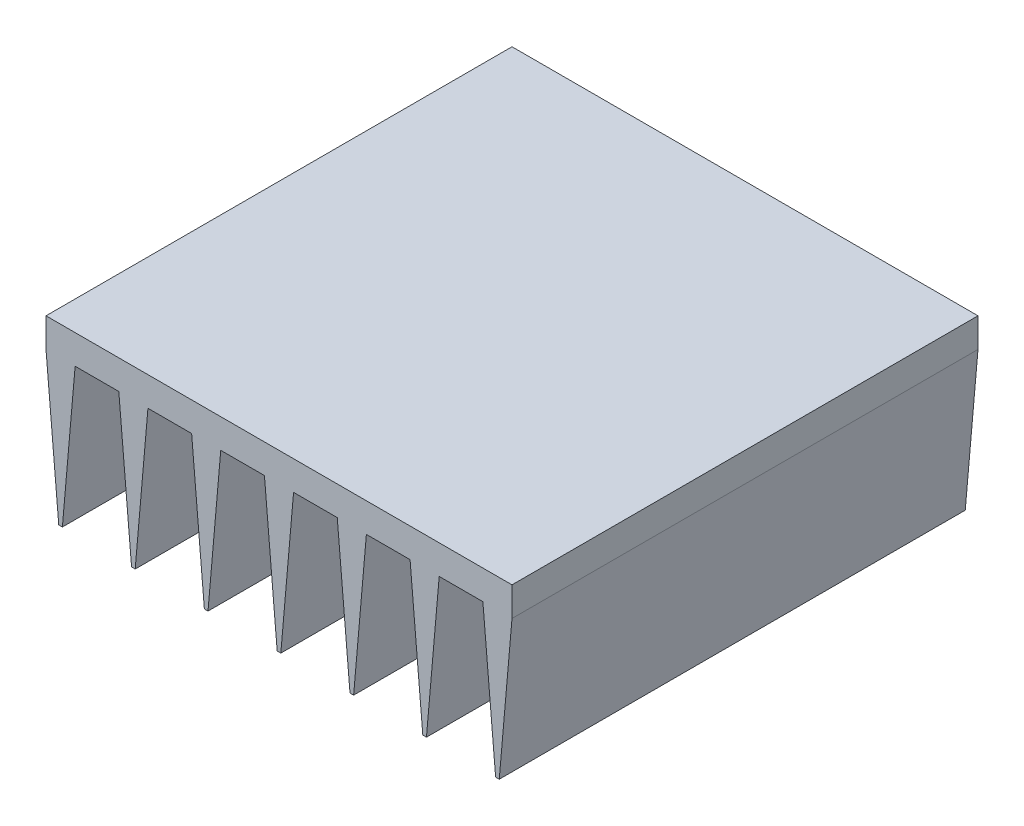
ISO-10303-21;
HEADER;
FILE_DESCRIPTION(('STEP AP214'),'2;1');
FILE_NAME('part.step','',(''),(''),'','','');
FILE_SCHEMA(('AUTOMOTIVE_DESIGN { 1 0 10303 214 1 1 1 1 }'));
ENDSEC;
DATA;
#1=APPLICATION_CONTEXT('core data for automotive mechanical design processes');
#2=APPLICATION_PROTOCOL_DEFINITION('international standard','automotive_design',2000,#1);
#3=PRODUCT_CONTEXT('',#1,'mechanical');
#4=PRODUCT('Part','Part','',(#3));
#5=PRODUCT_RELATED_PRODUCT_CATEGORY('part','',(#4));
#6=PRODUCT_DEFINITION_FORMATION('','',#4);
#7=PRODUCT_DEFINITION_CONTEXT('part definition',#1,'design');
#8=PRODUCT_DEFINITION('design','',#6,#7);
#9=PRODUCT_DEFINITION_SHAPE('','',#8);
#10=(LENGTH_UNIT() NAMED_UNIT(*) SI_UNIT(.MILLI.,.METRE.));
#11=(NAMED_UNIT(*) PLANE_ANGLE_UNIT() SI_UNIT($,.RADIAN.));
#12=(NAMED_UNIT(*) SI_UNIT($,.STERADIAN.) SOLID_ANGLE_UNIT());
#13=UNCERTAINTY_MEASURE_WITH_UNIT(LENGTH_MEASURE(1.E-05),#10,'distance_accuracy_value','');
#14=(GEOMETRIC_REPRESENTATION_CONTEXT(3) GLOBAL_UNCERTAINTY_ASSIGNED_CONTEXT((#13)) GLOBAL_UNIT_ASSIGNED_CONTEXT((#10,
#11,#12)) REPRESENTATION_CONTEXT('',''));
#15=CARTESIAN_POINT('',(0.,0.,0.));
#16=DIRECTION('',(0.,0.,1.));
#17=DIRECTION('',(1.,0.,0.));
#18=AXIS2_PLACEMENT_3D('',#15,#16,#17);
#19=CARTESIAN_POINT('',(0.,-3.175,0.));
#20=DIRECTION('',(0.,1.,0.));
#21=DIRECTION('',(0.,0.,1.));
#22=AXIS2_PLACEMENT_3D('',#19,#20,#21);
#23=PLANE('',#22);
#24=DIRECTION('',(-1.,0.,0.));
#25=VECTOR('',#24,1.);
#26=CARTESIAN_POINT('',(-25.4,-3.175,-25.4));
#27=LINE('',#26,#25);
#28=CARTESIAN_POINT('',(22.225,-3.175,-25.4));
#29=VERTEX_POINT('',#28);
#30=CARTESIAN_POINT('',(17.4625,-3.175,-25.4));
#31=VERTEX_POINT('',#30);
#32=EDGE_CURVE('E265',#29,#31,#27,.T.);
#33=ORIENTED_EDGE('',*,*,#32,.F.);
#34=DIRECTION('',(0.,0.,1.));
#35=VECTOR('',#34,1.);
#36=CARTESIAN_POINT('',(22.225,-3.175,-25.4));
#37=LINE('',#36,#35);
#38=CARTESIAN_POINT('',(22.225,-3.175,25.4));
#39=VERTEX_POINT('',#38);
#40=EDGE_CURVE('E247',#29,#39,#37,.T.);
#41=ORIENTED_EDGE('',*,*,#40,.T.);
#42=DIRECTION('',(1.,0.,0.));
#43=VECTOR('',#42,1.);
#44=CARTESIAN_POINT('',(-25.4,-3.175,25.4));
#45=LINE('',#44,#43);
#46=CARTESIAN_POINT('',(17.4625,-3.175,25.4));
#47=VERTEX_POINT('',#46);
#48=EDGE_CURVE('E304',#47,#39,#45,.T.);
#49=ORIENTED_EDGE('',*,*,#48,.F.);
#50=DIRECTION('',(0.,0.,1.));
#51=VECTOR('',#50,1.);
#52=CARTESIAN_POINT('',(17.4625,-3.175,-25.4));
#53=LINE('',#52,#51);
#54=EDGE_CURVE('E274',#31,#47,#53,.T.);
#55=ORIENTED_EDGE('',*,*,#54,.F.);
#56=EDGE_LOOP('',(#33,#41,#49,#55));
#57=FACE_BOUND('',#56,.T.);
#58=ADVANCED_FACE('F45',(#57),#23,.F.);
#59=CARTESIAN_POINT('',(14.2875,-3.175,-25.4));
#60=VERTEX_POINT('',#59);
#61=CARTESIAN_POINT('',(9.52500000000001,-3.175,-25.4));
#62=VERTEX_POINT('',#61);
#63=EDGE_CURVE('E276',#60,#62,#27,.T.);
#64=ORIENTED_EDGE('',*,*,#63,.F.);
#65=DIRECTION('',(0.,0.,1.));
#66=VECTOR('',#65,1.);
#67=CARTESIAN_POINT('',(14.2875,-3.175,-25.4));
#68=LINE('',#67,#66);
#69=CARTESIAN_POINT('',(14.2875,-3.175,25.4));
#70=VERTEX_POINT('',#69);
#71=EDGE_CURVE('E491',#60,#70,#68,.T.);
#72=ORIENTED_EDGE('',*,*,#71,.T.);
#73=CARTESIAN_POINT('',(9.525,-3.175,25.4));
#74=VERTEX_POINT('',#73);
#75=EDGE_CURVE('E550',#74,#70,#45,.T.);
#76=ORIENTED_EDGE('',*,*,#75,.F.);
#77=DIRECTION('',(0.,0.,1.));
#78=VECTOR('',#77,1.);
#79=CARTESIAN_POINT('',(9.52500000000001,-3.175,-25.4));
#80=LINE('',#79,#78);
#81=EDGE_CURVE('E447',#62,#74,#80,.T.);
#82=ORIENTED_EDGE('',*,*,#81,.F.);
#83=EDGE_LOOP('',(#64,#72,#76,#82));
#84=FACE_BOUND('',#83,.T.);
#85=ADVANCED_FACE('F613',(#84),#23,.F.);
#86=CARTESIAN_POINT('',(6.35,-3.175,-25.4));
#87=VERTEX_POINT('',#86);
#88=CARTESIAN_POINT('',(1.58750000000001,-3.175,-25.4));
#89=VERTEX_POINT('',#88);
#90=EDGE_CURVE('E282',#87,#89,#27,.T.);
#91=ORIENTED_EDGE('',*,*,#90,.F.);
#92=DIRECTION('',(0.,0.,1.));
#93=VECTOR('',#92,1.);
#94=CARTESIAN_POINT('',(6.35,-3.175,-25.4));
#95=LINE('',#94,#93);
#96=CARTESIAN_POINT('',(6.35,-3.175,25.4));
#97=VERTEX_POINT('',#96);
#98=EDGE_CURVE('E458',#87,#97,#95,.T.);
#99=ORIENTED_EDGE('',*,*,#98,.T.);
#100=CARTESIAN_POINT('',(1.5875,-3.175,25.4));
#101=VERTEX_POINT('',#100);
#102=EDGE_CURVE('E552',#101,#97,#45,.T.);
#103=ORIENTED_EDGE('',*,*,#102,.F.);
#104=DIRECTION('',(0.,0.,1.));
#105=VECTOR('',#104,1.);
#106=CARTESIAN_POINT('',(1.58750000000001,-3.175,-25.4));
#107=LINE('',#106,#105);
#108=EDGE_CURVE('E410',#89,#101,#107,.T.);
#109=ORIENTED_EDGE('',*,*,#108,.F.);
#110=EDGE_LOOP('',(#91,#99,#103,#109));
#111=FACE_BOUND('',#110,.T.);
#112=ADVANCED_FACE('F599',(#111),#23,.F.);
#113=CARTESIAN_POINT('',(-1.5875,-3.175,-25.4));
#114=VERTEX_POINT('',#113);
#115=CARTESIAN_POINT('',(-6.34999999999999,-3.175,-25.4));
#116=VERTEX_POINT('',#115);
#117=EDGE_CURVE('E294',#114,#116,#27,.T.);
#118=ORIENTED_EDGE('',*,*,#117,.F.);
#119=DIRECTION('',(0.,0.,1.));
#120=VECTOR('',#119,1.);
#121=CARTESIAN_POINT('',(-1.5875,-3.175,-25.4));
#122=LINE('',#121,#120);
#123=CARTESIAN_POINT('',(-1.5875,-3.175,25.4));
#124=VERTEX_POINT('',#123);
#125=EDGE_CURVE('E421',#114,#124,#122,.T.);
#126=ORIENTED_EDGE('',*,*,#125,.T.);
#127=CARTESIAN_POINT('',(-6.35,-3.175,25.4));
#128=VERTEX_POINT('',#127);
#129=EDGE_CURVE('E556',#128,#124,#45,.T.);
#130=ORIENTED_EDGE('',*,*,#129,.F.);
#131=DIRECTION('',(0.,0.,1.));
#132=VECTOR('',#131,1.);
#133=CARTESIAN_POINT('',(-6.34999999999999,-3.175,-25.4));
#134=LINE('',#133,#132);
#135=EDGE_CURVE('E373',#116,#128,#134,.T.);
#136=ORIENTED_EDGE('',*,*,#135,.F.);
#137=EDGE_LOOP('',(#118,#126,#130,#136));
#138=FACE_BOUND('',#137,.T.);
#139=ADVANCED_FACE('F584',(#138),#23,.F.);
#140=CARTESIAN_POINT('',(-9.525,-3.175,-25.4));
#141=VERTEX_POINT('',#140);
#142=CARTESIAN_POINT('',(-14.2875,-3.175,-25.4));
#143=VERTEX_POINT('',#142);
#144=EDGE_CURVE('E286',#141,#143,#27,.T.);
#145=ORIENTED_EDGE('',*,*,#144,.F.);
#146=DIRECTION('',(0.,0.,1.));
#147=VECTOR('',#146,1.);
#148=CARTESIAN_POINT('',(-9.525,-3.175,-25.4));
#149=LINE('',#148,#147);
#150=CARTESIAN_POINT('',(-9.525,-3.175,25.4));
#151=VERTEX_POINT('',#150);
#152=EDGE_CURVE('E384',#141,#151,#149,.T.);
#153=ORIENTED_EDGE('',*,*,#152,.T.);
#154=CARTESIAN_POINT('',(-14.2875,-3.175,25.4));
#155=VERTEX_POINT('',#154);
#156=EDGE_CURVE('E302',#155,#151,#45,.T.);
#157=ORIENTED_EDGE('',*,*,#156,.F.);
#158=DIRECTION('',(0.,0.,1.));
#159=VECTOR('',#158,1.);
#160=CARTESIAN_POINT('',(-14.2875,-3.175,-25.4));
#161=LINE('',#160,#159);
#162=EDGE_CURVE('E336',#143,#155,#161,.T.);
#163=ORIENTED_EDGE('',*,*,#162,.F.);
#164=EDGE_LOOP('',(#145,#153,#157,#163));
#165=FACE_BOUND('',#164,.T.);
#166=ADVANCED_FACE('F568',(#165),#23,.F.);
#167=CARTESIAN_POINT('',(-17.4625,-3.175,-25.4));
#168=VERTEX_POINT('',#167);
#169=CARTESIAN_POINT('',(-22.225,-3.175,-25.4));
#170=VERTEX_POINT('',#169);
#171=EDGE_CURVE('E278',#168,#170,#27,.T.);
#172=ORIENTED_EDGE('',*,*,#171,.F.);
#173=DIRECTION('',(0.,0.,1.));
#174=VECTOR('',#173,1.);
#175=CARTESIAN_POINT('',(-17.4625,-3.175,-25.4));
#176=LINE('',#175,#174);
#177=CARTESIAN_POINT('',(-17.4625,-3.175,25.4));
#178=VERTEX_POINT('',#177);
#179=EDGE_CURVE('E347',#168,#178,#176,.T.);
#180=ORIENTED_EDGE('',*,*,#179,.T.);
#181=CARTESIAN_POINT('',(-22.225,-3.175,25.4));
#182=VERTEX_POINT('',#181);
#183=EDGE_CURVE('E296',#182,#178,#45,.T.);
#184=ORIENTED_EDGE('',*,*,#183,.F.);
#185=DIRECTION('',(0.,0.,1.));
#186=VECTOR('',#185,1.);
#187=CARTESIAN_POINT('',(-22.225,-3.175,-25.4));
#188=LINE('',#187,#186);
#189=EDGE_CURVE('E318',#170,#182,#188,.T.);
#190=ORIENTED_EDGE('',*,*,#189,.F.);
#191=EDGE_LOOP('',(#172,#180,#184,#190));
#192=FACE_BOUND('',#191,.T.);
#193=ADVANCED_FACE('F634',(#192),#23,.F.);
#194=CARTESIAN_POINT('',(-25.4,-3.175,-25.4));
#195=DIRECTION('',(-1.,0.,0.));
#196=DIRECTION('',(0.,0.,1.));
#197=AXIS2_PLACEMENT_3D('',#194,#195,#196);
#198=PLANE('',#197);
#199=DIRECTION('',(0.,0.,1.));
#200=VECTOR('',#199,1.);
#201=CARTESIAN_POINT('',(-25.4,0.,-25.4));
#202=LINE('',#201,#200);
#203=CARTESIAN_POINT('',(-25.4,0.,-25.4));
#204=VERTEX_POINT('',#203);
#205=CARTESIAN_POINT('',(-25.4,0.,25.4));
#206=VERTEX_POINT('',#205);
#207=EDGE_CURVE('E322',#204,#206,#202,.T.);
#208=ORIENTED_EDGE('',*,*,#207,.F.);
#209=DIRECTION('',(0.,1.,0.));
#210=VECTOR('',#209,1.);
#211=CARTESIAN_POINT('',(-25.4,-3.175,-25.4));
#212=LINE('',#211,#210);
#213=CARTESIAN_POINT('',(-25.4,-3.175,-25.4));
#214=VERTEX_POINT('',#213);
#215=EDGE_CURVE('E11',#214,#204,#212,.T.);
#216=ORIENTED_EDGE('',*,*,#215,.F.);
#217=DIRECTION('',(0.,0.,1.));
#218=VECTOR('',#217,1.);
#219=CARTESIAN_POINT('',(-25.4,-3.175,-25.4));
#220=LINE('',#219,#218);
#221=CARTESIAN_POINT('',(-25.4,-3.175,25.4));
#222=VERTEX_POINT('',#221);
#223=EDGE_CURVE('E306',#214,#222,#220,.T.);
#224=ORIENTED_EDGE('',*,*,#223,.T.);
#225=DIRECTION('',(0.,1.,0.));
#226=VECTOR('',#225,1.);
#227=CARTESIAN_POINT('',(-25.4,-3.175,25.4));
#228=LINE('',#227,#226);
#229=EDGE_CURVE('E49',#222,#206,#228,.T.);
#230=ORIENTED_EDGE('',*,*,#229,.T.);
#231=EDGE_LOOP('',(#208,#216,#224,#230));
#232=FACE_BOUND('',#231,.T.);
#233=ADVANCED_FACE('F47',(#232),#198,.T.);
#234=CARTESIAN_POINT('',(-25.4,-3.175,-25.4));
#235=DIRECTION('',(0.,0.,-1.));
#236=DIRECTION('',(-1.,0.,0.));
#237=AXIS2_PLACEMENT_3D('',#234,#235,#236);
#238=PLANE('',#237);
#239=DIRECTION('',(-1.,0.,0.));
#240=VECTOR('',#239,1.);
#241=CARTESIAN_POINT('',(-25.4,0.,-25.4));
#242=LINE('',#241,#240);
#243=CARTESIAN_POINT('',(25.4,0.,-25.4));
#244=VERTEX_POINT('',#243);
#245=EDGE_CURVE('E310',#244,#204,#242,.T.);
#246=ORIENTED_EDGE('',*,*,#245,.F.);
#247=DIRECTION('',(0.,1.,0.));
#248=VECTOR('',#247,1.);
#249=CARTESIAN_POINT('',(25.4,-3.175,-25.4));
#250=LINE('',#249,#248);
#251=CARTESIAN_POINT('',(25.4,-3.175,-25.4));
#252=VERTEX_POINT('',#251);
#253=EDGE_CURVE('E55',#252,#244,#250,.T.);
#254=ORIENTED_EDGE('',*,*,#253,.F.);
#255=DIRECTION('',(0.0871867227206115,0.996191987209915,0.));
#256=VECTOR('',#255,1.);
#257=CARTESIAN_POINT('',(24.01062,-19.05,-25.4));
#258=LINE('',#257,#256);
#259=CARTESIAN_POINT('',(24.01062,-19.05,-25.4));
#260=VERTEX_POINT('',#259);
#261=EDGE_CURVE('E258',#260,#252,#258,.T.);
#262=ORIENTED_EDGE('',*,*,#261,.F.);
#263=DIRECTION('',(1.,0.,0.));
#264=VECTOR('',#263,1.);
#265=CARTESIAN_POINT('',(23.61438,-19.05,-25.4));
#266=LINE('',#265,#264);
#267=CARTESIAN_POINT('',(23.61438,-19.05,-25.4));
#268=VERTEX_POINT('',#267);
#269=EDGE_CURVE('E269',#268,#260,#266,.T.);
#270=ORIENTED_EDGE('',*,*,#269,.F.);
#271=DIRECTION('',(0.0871867227206121,-0.996191987209915,0.));
#272=VECTOR('',#271,1.);
#273=CARTESIAN_POINT('',(22.225,-3.175,-25.4));
#274=LINE('',#273,#272);
#275=EDGE_CURVE('E250',#29,#268,#274,.T.);
#276=ORIENTED_EDGE('',*,*,#275,.F.);
#277=ORIENTED_EDGE('',*,*,#32,.T.);
#278=DIRECTION('',(0.0871867227206115,0.996191987209915,0.));
#279=VECTOR('',#278,1.);
#280=CARTESIAN_POINT('',(16.07312,-19.05,-25.4));
#281=LINE('',#280,#279);
#282=CARTESIAN_POINT('',(16.07312,-19.05,-25.4));
#283=VERTEX_POINT('',#282);
#284=EDGE_CURVE('E496',#283,#31,#281,.T.);
#285=ORIENTED_EDGE('',*,*,#284,.F.);
#286=DIRECTION('',(1.,0.,0.));
#287=VECTOR('',#286,1.);
#288=CARTESIAN_POINT('',(15.67688,-19.05,-25.4));
#289=LINE('',#288,#287);
#290=CARTESIAN_POINT('',(15.67688,-19.05,-25.4));
#291=VERTEX_POINT('',#290);
#292=EDGE_CURVE('E517',#291,#283,#289,.T.);
#293=ORIENTED_EDGE('',*,*,#292,.F.);
#294=DIRECTION('',(0.0871867227206121,-0.996191987209915,0.));
#295=VECTOR('',#294,1.);
#296=CARTESIAN_POINT('',(14.2875,-3.175,-25.4));
#297=LINE('',#296,#295);
#298=EDGE_CURVE('E506',#60,#291,#297,.T.);
#299=ORIENTED_EDGE('',*,*,#298,.F.);
#300=ORIENTED_EDGE('',*,*,#63,.T.);
#301=DIRECTION('',(0.0871867227206115,0.996191987209915,0.));
#302=VECTOR('',#301,1.);
#303=CARTESIAN_POINT('',(8.13562000000001,-19.05,-25.4));
#304=LINE('',#303,#302);
#305=CARTESIAN_POINT('',(8.13562000000001,-19.05,-25.4));
#306=VERTEX_POINT('',#305);
#307=EDGE_CURVE('E463',#306,#62,#304,.T.);
#308=ORIENTED_EDGE('',*,*,#307,.F.);
#309=DIRECTION('',(1.,0.,0.));
#310=VECTOR('',#309,1.);
#311=CARTESIAN_POINT('',(7.73938000000001,-19.05,-25.4));
#312=LINE('',#311,#310);
#313=CARTESIAN_POINT('',(7.73938000000001,-19.05,-25.4));
#314=VERTEX_POINT('',#313);
#315=EDGE_CURVE('E484',#314,#306,#312,.T.);
#316=ORIENTED_EDGE('',*,*,#315,.F.);
#317=DIRECTION('',(0.0871867227206121,-0.996191987209915,0.));
#318=VECTOR('',#317,1.);
#319=CARTESIAN_POINT('',(6.35,-3.175,-25.4));
#320=LINE('',#319,#318);
#321=EDGE_CURVE('E473',#87,#314,#320,.T.);
#322=ORIENTED_EDGE('',*,*,#321,.F.);
#323=ORIENTED_EDGE('',*,*,#90,.T.);
#324=DIRECTION('',(0.0871867227206115,0.996191987209915,0.));
#325=VECTOR('',#324,1.);
#326=CARTESIAN_POINT('',(0.19812000000001,-19.05,-25.4));
#327=LINE('',#326,#325);
#328=CARTESIAN_POINT('',(0.19812000000001,-19.05,-25.4));
#329=VERTEX_POINT('',#328);
#330=EDGE_CURVE('E426',#329,#89,#327,.T.);
#331=ORIENTED_EDGE('',*,*,#330,.F.);
#332=DIRECTION('',(1.,0.,0.));
#333=VECTOR('',#332,1.);
#334=CARTESIAN_POINT('',(-0.198119999999989,-19.05,-25.4));
#335=LINE('',#334,#333);
#336=CARTESIAN_POINT('',(-0.198119999999989,-19.05,-25.4));
#337=VERTEX_POINT('',#336);
#338=EDGE_CURVE('E451',#337,#329,#335,.T.);
#339=ORIENTED_EDGE('',*,*,#338,.F.);
#340=DIRECTION('',(0.0871867227206121,-0.996191987209915,0.));
#341=VECTOR('',#340,1.);
#342=CARTESIAN_POINT('',(-1.5875,-3.175,-25.4));
#343=LINE('',#342,#341);
#344=EDGE_CURVE('E438',#114,#337,#343,.T.);
#345=ORIENTED_EDGE('',*,*,#344,.F.);
#346=ORIENTED_EDGE('',*,*,#117,.T.);
#347=DIRECTION('',(0.0871867227206115,0.996191987209915,0.));
#348=VECTOR('',#347,1.);
#349=CARTESIAN_POINT('',(-7.73937999999999,-19.05,-25.4));
#350=LINE('',#349,#348);
#351=CARTESIAN_POINT('',(-7.73937999999999,-19.05,-25.4));
#352=VERTEX_POINT('',#351);
#353=EDGE_CURVE('E389',#352,#116,#350,.T.);
#354=ORIENTED_EDGE('',*,*,#353,.F.);
#355=DIRECTION('',(1.,0.,0.));
#356=VECTOR('',#355,1.);
#357=CARTESIAN_POINT('',(-8.13561999999999,-19.05,-25.4));
#358=LINE('',#357,#356);
#359=CARTESIAN_POINT('',(-8.13561999999999,-19.05,-25.4));
#360=VERTEX_POINT('',#359);
#361=EDGE_CURVE('E414',#360,#352,#358,.T.);
#362=ORIENTED_EDGE('',*,*,#361,.F.);
#363=DIRECTION('',(0.0871867227206121,-0.996191987209915,0.));
#364=VECTOR('',#363,1.);
#365=CARTESIAN_POINT('',(-9.525,-3.175,-25.4));
#366=LINE('',#365,#364);
#367=EDGE_CURVE('E401',#141,#360,#366,.T.);
#368=ORIENTED_EDGE('',*,*,#367,.F.);
#369=ORIENTED_EDGE('',*,*,#144,.T.);
#370=DIRECTION('',(0.0871867227206115,0.996191987209915,0.));
#371=VECTOR('',#370,1.);
#372=CARTESIAN_POINT('',(-15.67688,-19.05,-25.4));
#373=LINE('',#372,#371);
#374=CARTESIAN_POINT('',(-15.67688,-19.05,-25.4));
#375=VERTEX_POINT('',#374);
#376=EDGE_CURVE('E352',#375,#143,#373,.T.);
#377=ORIENTED_EDGE('',*,*,#376,.F.);
#378=DIRECTION('',(1.,0.,0.));
#379=VECTOR('',#378,1.);
#380=CARTESIAN_POINT('',(-16.07312,-19.05,-25.4));
#381=LINE('',#380,#379);
#382=CARTESIAN_POINT('',(-16.07312,-19.05,-25.4));
#383=VERTEX_POINT('',#382);
#384=EDGE_CURVE('E377',#383,#375,#381,.T.);
#385=ORIENTED_EDGE('',*,*,#384,.F.);
#386=DIRECTION('',(0.0871867227206121,-0.996191987209915,0.));
#387=VECTOR('',#386,1.);
#388=CARTESIAN_POINT('',(-17.4625,-3.175,-25.4));
#389=LINE('',#388,#387);
#390=EDGE_CURVE('E364',#168,#383,#389,.T.);
#391=ORIENTED_EDGE('',*,*,#390,.F.);
#392=ORIENTED_EDGE('',*,*,#171,.T.);
#393=DIRECTION('',(0.0871867227206115,0.996191987209915,0.));
#394=VECTOR('',#393,1.);
#395=CARTESIAN_POINT('',(-23.61438,-19.05,-25.4));
#396=LINE('',#395,#394);
#397=CARTESIAN_POINT('',(-23.61438,-19.05,-25.4));
#398=VERTEX_POINT('',#397);
#399=EDGE_CURVE('E315',#398,#170,#396,.T.);
#400=ORIENTED_EDGE('',*,*,#399,.F.);
#401=DIRECTION('',(1.,0.,0.));
#402=VECTOR('',#401,1.);
#403=CARTESIAN_POINT('',(-24.01062,-19.05,-25.4));
#404=LINE('',#403,#402);
#405=CARTESIAN_POINT('',(-24.01062,-19.05,-25.4));
#406=VERTEX_POINT('',#405);
#407=EDGE_CURVE('E340',#406,#398,#404,.T.);
#408=ORIENTED_EDGE('',*,*,#407,.F.);
#409=DIRECTION('',(0.0871867227206121,-0.996191987209915,0.));
#410=VECTOR('',#409,1.);
#411=CARTESIAN_POINT('',(-25.4,-3.175,-25.4));
#412=LINE('',#411,#410);
#413=EDGE_CURVE('E327',#214,#406,#412,.T.);
#414=ORIENTED_EDGE('',*,*,#413,.F.);
#415=ORIENTED_EDGE('',*,*,#215,.T.);
#416=EDGE_LOOP('',(#246,#254,#262,#270,#276,#277,#285,#293,#299,#300,#308,#316,#322,#323,#331,
#339,#345,#346,#354,#362,#368,#369,#377,#385,#391,#392,#400,#408,#414,#415));
#417=FACE_BOUND('',#416,.T.);
#418=ADVANCED_FACE('F263',(#417),#238,.T.);
#419=CARTESIAN_POINT('',(25.4,-3.175,-25.4));
#420=DIRECTION('',(1.,0.,0.));
#421=DIRECTION('',(0.,0.,-1.));
#422=AXIS2_PLACEMENT_3D('',#419,#420,#421);
#423=PLANE('',#422);
#424=DIRECTION('',(0.,0.,-1.));
#425=VECTOR('',#424,1.);
#426=CARTESIAN_POINT('',(25.4,0.,-25.4));
#427=LINE('',#426,#425);
#428=CARTESIAN_POINT('',(25.4,0.,25.4));
#429=VERTEX_POINT('',#428);
#430=EDGE_CURVE('E664',#429,#244,#427,.T.);
#431=ORIENTED_EDGE('',*,*,#430,.F.);
#432=DIRECTION('',(0.,1.,0.));
#433=VECTOR('',#432,1.);
#434=CARTESIAN_POINT('',(25.4,-3.175,25.4));
#435=LINE('',#434,#433);
#436=CARTESIAN_POINT('',(25.4,-3.175,25.4));
#437=VERTEX_POINT('',#436);
#438=EDGE_CURVE('E281',#437,#429,#435,.T.);
#439=ORIENTED_EDGE('',*,*,#438,.F.);
#440=DIRECTION('',(0.,0.,-1.));
#441=VECTOR('',#440,1.);
#442=CARTESIAN_POINT('',(25.4,-3.175,-25.4));
#443=LINE('',#442,#441);
#444=EDGE_CURVE('E287',#437,#252,#443,.T.);
#445=ORIENTED_EDGE('',*,*,#444,.T.);
#446=ORIENTED_EDGE('',*,*,#253,.T.);
#447=EDGE_LOOP('',(#431,#439,#445,#446));
#448=FACE_BOUND('',#447,.T.);
#449=ADVANCED_FACE('F673',(#448),#423,.T.);
#450=CARTESIAN_POINT('',(-25.4,-3.175,25.4));
#451=DIRECTION('',(0.,0.,1.));
#452=DIRECTION('',(1.,0.,0.));
#453=AXIS2_PLACEMENT_3D('',#450,#451,#452);
#454=PLANE('',#453);
#455=DIRECTION('',(1.,0.,0.));
#456=VECTOR('',#455,1.);
#457=CARTESIAN_POINT('',(-25.4,0.,25.4));
#458=LINE('',#457,#456);
#459=EDGE_CURVE('E667',#206,#429,#458,.T.);
#460=ORIENTED_EDGE('',*,*,#459,.F.);
#461=ORIENTED_EDGE('',*,*,#229,.F.);
#462=DIRECTION('',(0.0871867227206121,-0.996191987209915,0.));
#463=VECTOR('',#462,1.);
#464=CARTESIAN_POINT('',(-25.4,-3.175,25.4));
#465=LINE('',#464,#463);
#466=CARTESIAN_POINT('',(-24.01062,-19.05,25.4));
#467=VERTEX_POINT('',#466);
#468=EDGE_CURVE('E332',#222,#467,#465,.T.);
#469=ORIENTED_EDGE('',*,*,#468,.T.);
#470=DIRECTION('',(1.,0.,0.));
#471=VECTOR('',#470,1.);
#472=CARTESIAN_POINT('',(-24.01062,-19.05,25.4));
#473=LINE('',#472,#471);
#474=CARTESIAN_POINT('',(-23.61438,-19.05,25.4));
#475=VERTEX_POINT('',#474);
#476=EDGE_CURVE('E328',#467,#475,#473,.T.);
#477=ORIENTED_EDGE('',*,*,#476,.T.);
#478=DIRECTION('',(0.0871867227206115,0.996191987209915,0.));
#479=VECTOR('',#478,1.);
#480=CARTESIAN_POINT('',(-23.61438,-19.05,25.4));
#481=LINE('',#480,#479);
#482=EDGE_CURVE('E323',#475,#182,#481,.T.);
#483=ORIENTED_EDGE('',*,*,#482,.T.);
#484=ORIENTED_EDGE('',*,*,#183,.T.);
#485=DIRECTION('',(0.0871867227206121,-0.996191987209915,0.));
#486=VECTOR('',#485,1.);
#487=CARTESIAN_POINT('',(-17.4625,-3.175,25.4));
#488=LINE('',#487,#486);
#489=CARTESIAN_POINT('',(-16.07312,-19.05,25.4));
#490=VERTEX_POINT('',#489);
#491=EDGE_CURVE('E369',#178,#490,#488,.T.);
#492=ORIENTED_EDGE('',*,*,#491,.T.);
#493=DIRECTION('',(1.,0.,0.));
#494=VECTOR('',#493,1.);
#495=CARTESIAN_POINT('',(-16.07312,-19.05,25.4));
#496=LINE('',#495,#494);
#497=CARTESIAN_POINT('',(-15.67688,-19.05,25.4));
#498=VERTEX_POINT('',#497);
#499=EDGE_CURVE('E365',#490,#498,#496,.T.);
#500=ORIENTED_EDGE('',*,*,#499,.T.);
#501=DIRECTION('',(0.0871867227206115,0.996191987209915,0.));
#502=VECTOR('',#501,1.);
#503=CARTESIAN_POINT('',(-15.67688,-19.05,25.4));
#504=LINE('',#503,#502);
#505=EDGE_CURVE('E361',#498,#155,#504,.T.);
#506=ORIENTED_EDGE('',*,*,#505,.T.);
#507=ORIENTED_EDGE('',*,*,#156,.T.);
#508=DIRECTION('',(0.0871867227206121,-0.996191987209915,0.));
#509=VECTOR('',#508,1.);
#510=CARTESIAN_POINT('',(-9.525,-3.175,25.4));
#511=LINE('',#510,#509);
#512=CARTESIAN_POINT('',(-8.13561999999999,-19.05,25.4));
#513=VERTEX_POINT('',#512);
#514=EDGE_CURVE('E406',#151,#513,#511,.T.);
#515=ORIENTED_EDGE('',*,*,#514,.T.);
#516=DIRECTION('',(1.,0.,0.));
#517=VECTOR('',#516,1.);
#518=CARTESIAN_POINT('',(-8.13561999999999,-19.05,25.4));
#519=LINE('',#518,#517);
#520=CARTESIAN_POINT('',(-7.73937999999999,-19.05,25.4));
#521=VERTEX_POINT('',#520);
#522=EDGE_CURVE('E402',#513,#521,#519,.T.);
#523=ORIENTED_EDGE('',*,*,#522,.T.);
#524=DIRECTION('',(0.0871867227206115,0.996191987209915,0.));
#525=VECTOR('',#524,1.);
#526=CARTESIAN_POINT('',(-7.73937999999999,-19.05,25.4));
#527=LINE('',#526,#525);
#528=EDGE_CURVE('E398',#521,#128,#527,.T.);
#529=ORIENTED_EDGE('',*,*,#528,.T.);
#530=ORIENTED_EDGE('',*,*,#129,.T.);
#531=DIRECTION('',(0.0871867227206121,-0.996191987209915,0.));
#532=VECTOR('',#531,1.);
#533=CARTESIAN_POINT('',(-1.5875,-3.175,25.4));
#534=LINE('',#533,#532);
#535=CARTESIAN_POINT('',(-0.198119999999989,-19.05,25.4));
#536=VERTEX_POINT('',#535);
#537=EDGE_CURVE('E443',#124,#536,#534,.T.);
#538=ORIENTED_EDGE('',*,*,#537,.T.);
#539=DIRECTION('',(1.,0.,0.));
#540=VECTOR('',#539,1.);
#541=CARTESIAN_POINT('',(-0.198119999999989,-19.05,25.4));
#542=LINE('',#541,#540);
#543=CARTESIAN_POINT('',(0.19812000000001,-19.05,25.4));
#544=VERTEX_POINT('',#543);
#545=EDGE_CURVE('E439',#536,#544,#542,.T.);
#546=ORIENTED_EDGE('',*,*,#545,.T.);
#547=DIRECTION('',(0.0871867227206115,0.996191987209915,0.));
#548=VECTOR('',#547,1.);
#549=CARTESIAN_POINT('',(0.19812000000001,-19.05,25.4));
#550=LINE('',#549,#548);
#551=EDGE_CURVE('E435',#544,#101,#550,.T.);
#552=ORIENTED_EDGE('',*,*,#551,.T.);
#553=ORIENTED_EDGE('',*,*,#102,.T.);
#554=DIRECTION('',(0.0871867227206121,-0.996191987209915,0.));
#555=VECTOR('',#554,1.);
#556=CARTESIAN_POINT('',(6.35,-3.175,25.4));
#557=LINE('',#556,#555);
#558=CARTESIAN_POINT('',(7.73938000000001,-19.05,25.4));
#559=VERTEX_POINT('',#558);
#560=EDGE_CURVE('E477',#97,#559,#557,.T.);
#561=ORIENTED_EDGE('',*,*,#560,.T.);
#562=DIRECTION('',(1.,0.,0.));
#563=VECTOR('',#562,1.);
#564=CARTESIAN_POINT('',(7.73938000000001,-19.05,25.4));
#565=LINE('',#564,#563);
#566=CARTESIAN_POINT('',(8.13562000000001,-19.05,25.4));
#567=VERTEX_POINT('',#566);
#568=EDGE_CURVE('E474',#559,#567,#565,.T.);
#569=ORIENTED_EDGE('',*,*,#568,.T.);
#570=DIRECTION('',(0.0871867227206115,0.996191987209915,0.));
#571=VECTOR('',#570,1.);
#572=CARTESIAN_POINT('',(8.13562000000001,-19.05,25.4));
#573=LINE('',#572,#571);
#574=EDGE_CURVE('E70',#567,#74,#573,.T.);
#575=ORIENTED_EDGE('',*,*,#574,.T.);
#576=ORIENTED_EDGE('',*,*,#75,.T.);
#577=DIRECTION('',(0.0871867227206121,-0.996191987209915,0.));
#578=VECTOR('',#577,1.);
#579=CARTESIAN_POINT('',(14.2875,-3.175,25.4));
#580=LINE('',#579,#578);
#581=CARTESIAN_POINT('',(15.67688,-19.05,25.4));
#582=VERTEX_POINT('',#581);
#583=EDGE_CURVE('E510',#70,#582,#580,.T.);
#584=ORIENTED_EDGE('',*,*,#583,.T.);
#585=DIRECTION('',(1.,0.,0.));
#586=VECTOR('',#585,1.);
#587=CARTESIAN_POINT('',(15.67688,-19.05,25.4));
#588=LINE('',#587,#586);
#589=CARTESIAN_POINT('',(16.07312,-19.05,25.4));
#590=VERTEX_POINT('',#589);
#591=EDGE_CURVE('E507',#582,#590,#588,.T.);
#592=ORIENTED_EDGE('',*,*,#591,.T.);
#593=DIRECTION('',(0.0871867227206115,0.996191987209915,0.));
#594=VECTOR('',#593,1.);
#595=CARTESIAN_POINT('',(16.07312,-19.05,25.4));
#596=LINE('',#595,#594);
#597=EDGE_CURVE('E63',#590,#47,#596,.T.);
#598=ORIENTED_EDGE('',*,*,#597,.T.);
#599=ORIENTED_EDGE('',*,*,#48,.T.);
#600=DIRECTION('',(0.0871867227206121,-0.996191987209915,0.));
#601=VECTOR('',#600,1.);
#602=CARTESIAN_POINT('',(22.225,-3.175,25.4));
#603=LINE('',#602,#601);
#604=CARTESIAN_POINT('',(23.61438,-19.05,25.4));
#605=VERTEX_POINT('',#604);
#606=EDGE_CURVE('E252',#39,#605,#603,.T.);
#607=ORIENTED_EDGE('',*,*,#606,.T.);
#608=DIRECTION('',(1.,0.,0.));
#609=VECTOR('',#608,1.);
#610=CARTESIAN_POINT('',(23.61438,-19.05,25.4));
#611=LINE('',#610,#609);
#612=CARTESIAN_POINT('',(24.01062,-19.05,25.4));
#613=VERTEX_POINT('',#612);
#614=EDGE_CURVE('E530',#605,#613,#611,.T.);
#615=ORIENTED_EDGE('',*,*,#614,.T.);
#616=DIRECTION('',(0.0871867227206115,0.996191987209915,0.));
#617=VECTOR('',#616,1.);
#618=CARTESIAN_POINT('',(24.01062,-19.05,25.4));
#619=LINE('',#618,#617);
#620=EDGE_CURVE('E271',#613,#437,#619,.T.);
#621=ORIENTED_EDGE('',*,*,#620,.T.);
#622=ORIENTED_EDGE('',*,*,#438,.T.);
#623=EDGE_LOOP('',(#460,#461,#469,#477,#483,#484,#492,#500,#506,#507,#515,#523,#529,#530,#538,
#546,#552,#553,#561,#569,#575,#576,#584,#592,#598,#599,#607,#615,#621,#622));
#624=FACE_BOUND('',#623,.T.);
#625=ADVANCED_FACE('F547',(#624),#454,.T.);
#626=CARTESIAN_POINT('',(0.,0.,0.));
#627=DIRECTION('',(0.,1.,0.));
#628=DIRECTION('',(0.,0.,1.));
#629=AXIS2_PLACEMENT_3D('',#626,#627,#628);
#630=PLANE('',#629);
#631=ORIENTED_EDGE('',*,*,#207,.T.);
#632=ORIENTED_EDGE('',*,*,#459,.T.);
#633=ORIENTED_EDGE('',*,*,#430,.T.);
#634=ORIENTED_EDGE('',*,*,#245,.T.);
#635=EDGE_LOOP('',(#631,#632,#633,#634));
#636=FACE_BOUND('',#635,.T.);
#637=ADVANCED_FACE('F675',(#636),#630,.T.);
#638=CARTESIAN_POINT('',(-23.61438,-19.05,-25.4));
#639=DIRECTION('',(0.996191987209915,-0.0871867227206115,0.));
#640=DIRECTION('',(0.0871867227206115,0.996191987209915,0.));
#641=AXIS2_PLACEMENT_3D('',#638,#639,#640);
#642=PLANE('',#641);
#643=ORIENTED_EDGE('',*,*,#482,.F.);
#644=DIRECTION('',(0.,0.,1.));
#645=VECTOR('',#644,1.);
#646=CARTESIAN_POINT('',(-23.61438,-19.05,-25.4));
#647=LINE('',#646,#645);
#648=EDGE_CURVE('E314',#398,#475,#647,.T.);
#649=ORIENTED_EDGE('',*,*,#648,.F.);
#650=ORIENTED_EDGE('',*,*,#399,.T.);
#651=ORIENTED_EDGE('',*,*,#189,.T.);
#652=EDGE_LOOP('',(#643,#649,#650,#651));
#653=FACE_BOUND('',#652,.T.);
#654=ADVANCED_FACE('F649',(#653),#642,.T.);
#655=CARTESIAN_POINT('',(-24.01062,-19.05,-25.4));
#656=DIRECTION('',(0.,-1.,0.));
#657=DIRECTION('',(0.,0.,-1.));
#658=AXIS2_PLACEMENT_3D('',#655,#656,#657);
#659=PLANE('',#658);
#660=ORIENTED_EDGE('',*,*,#476,.F.);
#661=DIRECTION('',(0.,0.,1.));
#662=VECTOR('',#661,1.);
#663=CARTESIAN_POINT('',(-24.01062,-19.05,-25.4));
#664=LINE('',#663,#662);
#665=EDGE_CURVE('E311',#406,#467,#664,.T.);
#666=ORIENTED_EDGE('',*,*,#665,.F.);
#667=ORIENTED_EDGE('',*,*,#407,.T.);
#668=ORIENTED_EDGE('',*,*,#648,.T.);
#669=EDGE_LOOP('',(#660,#666,#667,#668));
#670=FACE_BOUND('',#669,.T.);
#671=ADVANCED_FACE('F678',(#670),#659,.T.);
#672=CARTESIAN_POINT('',(-25.4,-3.175,-25.4));
#673=DIRECTION('',(-0.996191987209915,-0.0871867227206121,0.));
#674=DIRECTION('',(0.0871867227206121,-0.996191987209915,0.));
#675=AXIS2_PLACEMENT_3D('',#672,#673,#674);
#676=PLANE('',#675);
#677=ORIENTED_EDGE('',*,*,#468,.F.);
#678=ORIENTED_EDGE('',*,*,#223,.F.);
#679=ORIENTED_EDGE('',*,*,#413,.T.);
#680=ORIENTED_EDGE('',*,*,#665,.T.);
#681=EDGE_LOOP('',(#677,#678,#679,#680));
#682=FACE_BOUND('',#681,.T.);
#683=ADVANCED_FACE('F656',(#682),#676,.T.);
#684=CARTESIAN_POINT('',(-15.67688,-19.05,-25.4));
#685=DIRECTION('',(0.996191987209915,-0.0871867227206115,0.));
#686=DIRECTION('',(0.0871867227206115,0.996191987209915,0.));
#687=AXIS2_PLACEMENT_3D('',#684,#685,#686);
#688=PLANE('',#687);
#689=ORIENTED_EDGE('',*,*,#505,.F.);
#690=DIRECTION('',(0.,0.,1.));
#691=VECTOR('',#690,1.);
#692=CARTESIAN_POINT('',(-15.67688,-19.05,-25.4));
#693=LINE('',#692,#691);
#694=EDGE_CURVE('E355',#375,#498,#693,.T.);
#695=ORIENTED_EDGE('',*,*,#694,.F.);
#696=ORIENTED_EDGE('',*,*,#376,.T.);
#697=ORIENTED_EDGE('',*,*,#162,.T.);
#698=EDGE_LOOP('',(#689,#695,#696,#697));
#699=FACE_BOUND('',#698,.T.);
#700=ADVANCED_FACE('F685',(#699),#688,.T.);
#701=CARTESIAN_POINT('',(-16.07312,-19.05,-25.4));
#702=DIRECTION('',(0.,-1.,0.));
#703=DIRECTION('',(0.,0.,-1.));
#704=AXIS2_PLACEMENT_3D('',#701,#702,#703);
#705=PLANE('',#704);
#706=ORIENTED_EDGE('',*,*,#499,.F.);
#707=DIRECTION('',(0.,0.,1.));
#708=VECTOR('',#707,1.);
#709=CARTESIAN_POINT('',(-16.07312,-19.05,-25.4));
#710=LINE('',#709,#708);
#711=EDGE_CURVE('E351',#383,#490,#710,.T.);
#712=ORIENTED_EDGE('',*,*,#711,.F.);
#713=ORIENTED_EDGE('',*,*,#384,.T.);
#714=ORIENTED_EDGE('',*,*,#694,.T.);
#715=EDGE_LOOP('',(#706,#712,#713,#714));
#716=FACE_BOUND('',#715,.T.);
#717=ADVANCED_FACE('F691',(#716),#705,.T.);
#718=CARTESIAN_POINT('',(-17.4625,-3.175,-25.4));
#719=DIRECTION('',(-0.996191987209915,-0.0871867227206121,0.));
#720=DIRECTION('',(0.0871867227206121,-0.996191987209915,0.));
#721=AXIS2_PLACEMENT_3D('',#718,#719,#720);
#722=PLANE('',#721);
#723=ORIENTED_EDGE('',*,*,#491,.F.);
#724=ORIENTED_EDGE('',*,*,#179,.F.);
#725=ORIENTED_EDGE('',*,*,#390,.T.);
#726=ORIENTED_EDGE('',*,*,#711,.T.);
#727=EDGE_LOOP('',(#723,#724,#725,#726));
#728=FACE_BOUND('',#727,.T.);
#729=ADVANCED_FACE('F688',(#728),#722,.T.);
#730=CARTESIAN_POINT('',(-7.73937999999999,-19.05,-25.4));
#731=DIRECTION('',(0.996191987209915,-0.0871867227206115,0.));
#732=DIRECTION('',(0.0871867227206115,0.996191987209915,0.));
#733=AXIS2_PLACEMENT_3D('',#730,#731,#732);
#734=PLANE('',#733);
#735=ORIENTED_EDGE('',*,*,#528,.F.);
#736=DIRECTION('',(0.,0.,1.));
#737=VECTOR('',#736,1.);
#738=CARTESIAN_POINT('',(-7.73937999999999,-19.05,-25.4));
#739=LINE('',#738,#737);
#740=EDGE_CURVE('E392',#352,#521,#739,.T.);
#741=ORIENTED_EDGE('',*,*,#740,.F.);
#742=ORIENTED_EDGE('',*,*,#353,.T.);
#743=ORIENTED_EDGE('',*,*,#135,.T.);
#744=EDGE_LOOP('',(#735,#741,#742,#743));
#745=FACE_BOUND('',#744,.T.);
#746=ADVANCED_FACE('F580',(#745),#734,.T.);
#747=CARTESIAN_POINT('',(-8.13561999999999,-19.05,-25.4));
#748=DIRECTION('',(0.,-1.,0.));
#749=DIRECTION('',(0.,0.,-1.));
#750=AXIS2_PLACEMENT_3D('',#747,#748,#749);
#751=PLANE('',#750);
#752=ORIENTED_EDGE('',*,*,#522,.F.);
#753=DIRECTION('',(0.,0.,1.));
#754=VECTOR('',#753,1.);
#755=CARTESIAN_POINT('',(-8.13561999999999,-19.05,-25.4));
#756=LINE('',#755,#754);
#757=EDGE_CURVE('E388',#360,#513,#756,.T.);
#758=ORIENTED_EDGE('',*,*,#757,.F.);
#759=ORIENTED_EDGE('',*,*,#361,.T.);
#760=ORIENTED_EDGE('',*,*,#740,.T.);
#761=EDGE_LOOP('',(#752,#758,#759,#760));
#762=FACE_BOUND('',#761,.T.);
#763=ADVANCED_FACE('F577',(#762),#751,.T.);
#764=CARTESIAN_POINT('',(-9.525,-3.175,-25.4));
#765=DIRECTION('',(-0.996191987209915,-0.0871867227206121,0.));
#766=DIRECTION('',(0.0871867227206121,-0.996191987209915,0.));
#767=AXIS2_PLACEMENT_3D('',#764,#765,#766);
#768=PLANE('',#767);
#769=ORIENTED_EDGE('',*,*,#514,.F.);
#770=ORIENTED_EDGE('',*,*,#152,.F.);
#771=ORIENTED_EDGE('',*,*,#367,.T.);
#772=ORIENTED_EDGE('',*,*,#757,.T.);
#773=EDGE_LOOP('',(#769,#770,#771,#772));
#774=FACE_BOUND('',#773,.T.);
#775=ADVANCED_FACE('F571',(#774),#768,.T.);
#776=CARTESIAN_POINT('',(0.19812000000001,-19.05,-25.4));
#777=DIRECTION('',(0.996191987209915,-0.0871867227206115,0.));
#778=DIRECTION('',(0.0871867227206115,0.996191987209915,0.));
#779=AXIS2_PLACEMENT_3D('',#776,#777,#778);
#780=PLANE('',#779);
#781=ORIENTED_EDGE('',*,*,#551,.F.);
#782=DIRECTION('',(0.,0.,1.));
#783=VECTOR('',#782,1.);
#784=CARTESIAN_POINT('',(0.19812000000001,-19.05,-25.4));
#785=LINE('',#784,#783);
#786=EDGE_CURVE('E429',#329,#544,#785,.T.);
#787=ORIENTED_EDGE('',*,*,#786,.F.);
#788=ORIENTED_EDGE('',*,*,#330,.T.);
#789=ORIENTED_EDGE('',*,*,#108,.T.);
#790=EDGE_LOOP('',(#781,#787,#788,#789));
#791=FACE_BOUND('',#790,.T.);
#792=ADVANCED_FACE('F595',(#791),#780,.T.);
#793=CARTESIAN_POINT('',(-0.198119999999989,-19.05,-25.4));
#794=DIRECTION('',(0.,-1.,0.));
#795=DIRECTION('',(0.,0.,-1.));
#796=AXIS2_PLACEMENT_3D('',#793,#794,#795);
#797=PLANE('',#796);
#798=ORIENTED_EDGE('',*,*,#545,.F.);
#799=DIRECTION('',(0.,0.,1.));
#800=VECTOR('',#799,1.);
#801=CARTESIAN_POINT('',(-0.198119999999989,-19.05,-25.4));
#802=LINE('',#801,#800);
#803=EDGE_CURVE('E425',#337,#536,#802,.T.);
#804=ORIENTED_EDGE('',*,*,#803,.F.);
#805=ORIENTED_EDGE('',*,*,#338,.T.);
#806=ORIENTED_EDGE('',*,*,#786,.T.);
#807=EDGE_LOOP('',(#798,#804,#805,#806));
#808=FACE_BOUND('',#807,.T.);
#809=ADVANCED_FACE('F592',(#808),#797,.T.);
#810=CARTESIAN_POINT('',(-1.5875,-3.175,-25.4));
#811=DIRECTION('',(-0.996191987209915,-0.0871867227206121,0.));
#812=DIRECTION('',(0.0871867227206121,-0.996191987209915,0.));
#813=AXIS2_PLACEMENT_3D('',#810,#811,#812);
#814=PLANE('',#813);
#815=ORIENTED_EDGE('',*,*,#537,.F.);
#816=ORIENTED_EDGE('',*,*,#125,.F.);
#817=ORIENTED_EDGE('',*,*,#344,.T.);
#818=ORIENTED_EDGE('',*,*,#803,.T.);
#819=EDGE_LOOP('',(#815,#816,#817,#818));
#820=FACE_BOUND('',#819,.T.);
#821=ADVANCED_FACE('F587',(#820),#814,.T.);
#822=CARTESIAN_POINT('',(8.13562000000001,-19.05,-25.4));
#823=DIRECTION('',(0.996191987209915,-0.0871867227206115,0.));
#824=DIRECTION('',(0.0871867227206115,0.996191987209915,0.));
#825=AXIS2_PLACEMENT_3D('',#822,#823,#824);
#826=PLANE('',#825);
#827=ORIENTED_EDGE('',*,*,#574,.F.);
#828=DIRECTION('',(0.,0.,1.));
#829=VECTOR('',#828,1.);
#830=CARTESIAN_POINT('',(8.13562000000001,-19.05,-25.4));
#831=LINE('',#830,#829);
#832=EDGE_CURVE('E466',#306,#567,#831,.T.);
#833=ORIENTED_EDGE('',*,*,#832,.F.);
#834=ORIENTED_EDGE('',*,*,#307,.T.);
#835=ORIENTED_EDGE('',*,*,#81,.T.);
#836=EDGE_LOOP('',(#827,#833,#834,#835));
#837=FACE_BOUND('',#836,.T.);
#838=ADVANCED_FACE('F609',(#837),#826,.T.);
#839=CARTESIAN_POINT('',(7.73938000000001,-19.05,-25.4));
#840=DIRECTION('',(0.,-1.,0.));
#841=DIRECTION('',(0.,0.,-1.));
#842=AXIS2_PLACEMENT_3D('',#839,#840,#841);
#843=PLANE('',#842);
#844=ORIENTED_EDGE('',*,*,#568,.F.);
#845=DIRECTION('',(0.,0.,1.));
#846=VECTOR('',#845,1.);
#847=CARTESIAN_POINT('',(7.73938000000001,-19.05,-25.4));
#848=LINE('',#847,#846);
#849=EDGE_CURVE('E462',#314,#559,#848,.T.);
#850=ORIENTED_EDGE('',*,*,#849,.F.);
#851=ORIENTED_EDGE('',*,*,#315,.T.);
#852=ORIENTED_EDGE('',*,*,#832,.T.);
#853=EDGE_LOOP('',(#844,#850,#851,#852));
#854=FACE_BOUND('',#853,.T.);
#855=ADVANCED_FACE('F607',(#854),#843,.T.);
#856=CARTESIAN_POINT('',(6.35,-3.175,-25.4));
#857=DIRECTION('',(-0.996191987209915,-0.0871867227206121,0.));
#858=DIRECTION('',(0.0871867227206121,-0.996191987209915,0.));
#859=AXIS2_PLACEMENT_3D('',#856,#857,#858);
#860=PLANE('',#859);
#861=ORIENTED_EDGE('',*,*,#560,.F.);
#862=ORIENTED_EDGE('',*,*,#98,.F.);
#863=ORIENTED_EDGE('',*,*,#321,.T.);
#864=ORIENTED_EDGE('',*,*,#849,.T.);
#865=EDGE_LOOP('',(#861,#862,#863,#864));
#866=FACE_BOUND('',#865,.T.);
#867=ADVANCED_FACE('F602',(#866),#860,.T.);
#868=CARTESIAN_POINT('',(16.07312,-19.05,-25.4));
#869=DIRECTION('',(0.996191987209915,-0.0871867227206115,0.));
#870=DIRECTION('',(0.0871867227206115,0.996191987209915,0.));
#871=AXIS2_PLACEMENT_3D('',#868,#869,#870);
#872=PLANE('',#871);
#873=ORIENTED_EDGE('',*,*,#597,.F.);
#874=DIRECTION('',(0.,0.,1.));
#875=VECTOR('',#874,1.);
#876=CARTESIAN_POINT('',(16.07312,-19.05,-25.4));
#877=LINE('',#876,#875);
#878=EDGE_CURVE('E499',#283,#590,#877,.T.);
#879=ORIENTED_EDGE('',*,*,#878,.F.);
#880=ORIENTED_EDGE('',*,*,#284,.T.);
#881=ORIENTED_EDGE('',*,*,#54,.T.);
#882=EDGE_LOOP('',(#873,#879,#880,#881));
#883=FACE_BOUND('',#882,.T.);
#884=ADVANCED_FACE('F622',(#883),#872,.T.);
#885=CARTESIAN_POINT('',(15.67688,-19.05,-25.4));
#886=DIRECTION('',(0.,-1.,0.));
#887=DIRECTION('',(0.,0.,-1.));
#888=AXIS2_PLACEMENT_3D('',#885,#886,#887);
#889=PLANE('',#888);
#890=ORIENTED_EDGE('',*,*,#591,.F.);
#891=DIRECTION('',(0.,0.,1.));
#892=VECTOR('',#891,1.);
#893=CARTESIAN_POINT('',(15.67688,-19.05,-25.4));
#894=LINE('',#893,#892);
#895=EDGE_CURVE('E495',#291,#582,#894,.T.);
#896=ORIENTED_EDGE('',*,*,#895,.F.);
#897=ORIENTED_EDGE('',*,*,#292,.T.);
#898=ORIENTED_EDGE('',*,*,#878,.T.);
#899=EDGE_LOOP('',(#890,#896,#897,#898));
#900=FACE_BOUND('',#899,.T.);
#901=ADVANCED_FACE('F620',(#900),#889,.T.);
#902=CARTESIAN_POINT('',(14.2875,-3.175,-25.4));
#903=DIRECTION('',(-0.996191987209915,-0.0871867227206121,0.));
#904=DIRECTION('',(0.0871867227206121,-0.996191987209915,0.));
#905=AXIS2_PLACEMENT_3D('',#902,#903,#904);
#906=PLANE('',#905);
#907=ORIENTED_EDGE('',*,*,#583,.F.);
#908=ORIENTED_EDGE('',*,*,#71,.F.);
#909=ORIENTED_EDGE('',*,*,#298,.T.);
#910=ORIENTED_EDGE('',*,*,#895,.T.);
#911=EDGE_LOOP('',(#907,#908,#909,#910));
#912=FACE_BOUND('',#911,.T.);
#913=ADVANCED_FACE('F616',(#912),#906,.T.);
#914=CARTESIAN_POINT('',(24.01062,-19.05,-25.4));
#915=DIRECTION('',(0.996191987209915,-0.0871867227206115,0.));
#916=DIRECTION('',(0.0871867227206115,0.996191987209915,0.));
#917=AXIS2_PLACEMENT_3D('',#914,#915,#916);
#918=PLANE('',#917);
#919=ORIENTED_EDGE('',*,*,#620,.F.);
#920=DIRECTION('',(0.,0.,1.));
#921=VECTOR('',#920,1.);
#922=CARTESIAN_POINT('',(24.01062,-19.05,-25.4));
#923=LINE('',#922,#921);
#924=EDGE_CURVE('E514',#260,#613,#923,.T.);
#925=ORIENTED_EDGE('',*,*,#924,.F.);
#926=ORIENTED_EDGE('',*,*,#261,.T.);
#927=ORIENTED_EDGE('',*,*,#444,.F.);
#928=EDGE_LOOP('',(#919,#925,#926,#927));
#929=FACE_BOUND('',#928,.T.);
#930=ADVANCED_FACE('F545',(#929),#918,.T.);
#931=CARTESIAN_POINT('',(23.61438,-19.05,-25.4));
#932=DIRECTION('',(0.,-1.,0.));
#933=DIRECTION('',(0.,0.,-1.));
#934=AXIS2_PLACEMENT_3D('',#931,#932,#933);
#935=PLANE('',#934);
#936=ORIENTED_EDGE('',*,*,#614,.F.);
#937=DIRECTION('',(0.,0.,1.));
#938=VECTOR('',#937,1.);
#939=CARTESIAN_POINT('',(23.61438,-19.05,-25.4));
#940=LINE('',#939,#938);
#941=EDGE_CURVE('E257',#268,#605,#940,.T.);
#942=ORIENTED_EDGE('',*,*,#941,.F.);
#943=ORIENTED_EDGE('',*,*,#269,.T.);
#944=ORIENTED_EDGE('',*,*,#924,.T.);
#945=EDGE_LOOP('',(#936,#942,#943,#944));
#946=FACE_BOUND('',#945,.T.);
#947=ADVANCED_FACE('F541',(#946),#935,.T.);
#948=CARTESIAN_POINT('',(22.225,-3.175,-25.4));
#949=DIRECTION('',(-0.996191987209915,-0.0871867227206121,0.));
#950=DIRECTION('',(0.0871867227206121,-0.996191987209915,0.));
#951=AXIS2_PLACEMENT_3D('',#948,#949,#950);
#952=PLANE('',#951);
#953=ORIENTED_EDGE('',*,*,#606,.F.);
#954=ORIENTED_EDGE('',*,*,#40,.F.);
#955=ORIENTED_EDGE('',*,*,#275,.T.);
#956=ORIENTED_EDGE('',*,*,#941,.T.);
#957=EDGE_LOOP('',(#953,#954,#955,#956));
#958=FACE_BOUND('',#957,.T.);
#959=ADVANCED_FACE('F249',(#958),#952,.T.);
#960=CLOSED_SHELL('',(#58,#85,#112,#139,#166,#193,#233,#418,#449,#625,#637,#654,#671,#683,#700,
#717,#729,#746,#763,#775,#792,#809,#821,#838,#855,#867,#884,#901,#913,#930,#947,#959));
#961=MANIFOLD_SOLID_BREP('B2',#960);
#962=ADVANCED_BREP_SHAPE_REPRESENTATION('',(#18,#961),#14);
#963=SHAPE_DEFINITION_REPRESENTATION(#9,#962);
ENDSEC;
END-ISO-10303-21;
